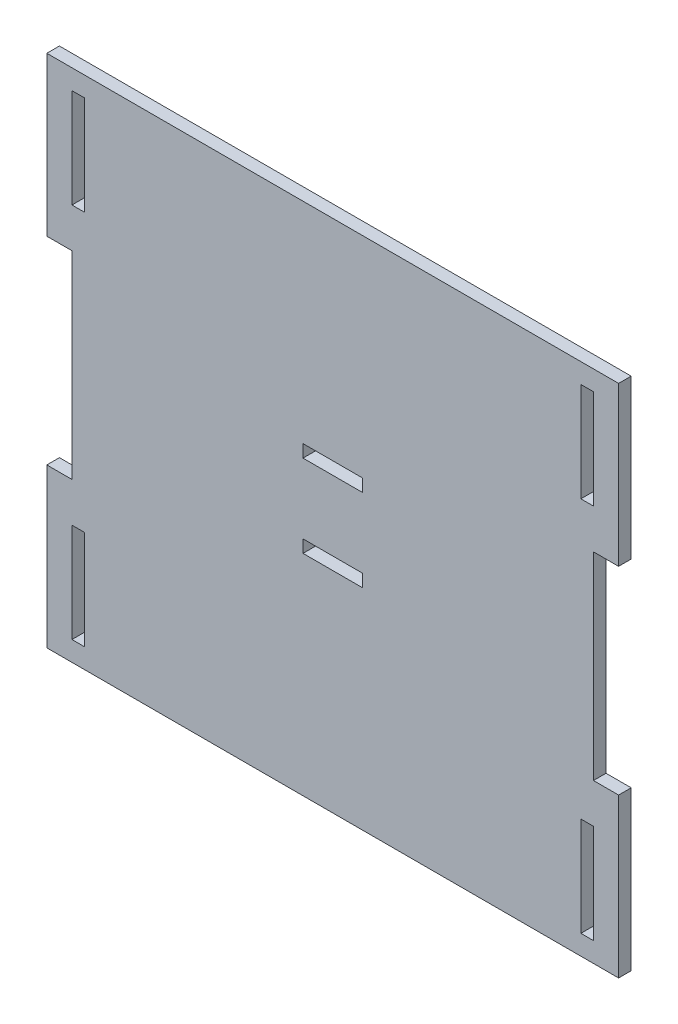
ISO-10303-21;
HEADER;
FILE_DESCRIPTION(('STEP AP214'),'2;1');
FILE_NAME('part.step','',(''),(''),'','','');
FILE_SCHEMA(('AUTOMOTIVE_DESIGN { 1 0 10303 214 1 1 1 1 }'));
ENDSEC;
DATA;
#1=APPLICATION_CONTEXT('core data for automotive mechanical design processes');
#2=APPLICATION_PROTOCOL_DEFINITION('international standard','automotive_design',2000,#1);
#3=PRODUCT_CONTEXT('',#1,'mechanical');
#4=PRODUCT('Part','Part','',(#3));
#5=PRODUCT_RELATED_PRODUCT_CATEGORY('part','',(#4));
#6=PRODUCT_DEFINITION_FORMATION('','',#4);
#7=PRODUCT_DEFINITION_CONTEXT('part definition',#1,'design');
#8=PRODUCT_DEFINITION('design','',#6,#7);
#9=PRODUCT_DEFINITION_SHAPE('','',#8);
#10=(LENGTH_UNIT() NAMED_UNIT(*) SI_UNIT(.MILLI.,.METRE.));
#11=(NAMED_UNIT(*) PLANE_ANGLE_UNIT() SI_UNIT($,.RADIAN.));
#12=(NAMED_UNIT(*) SI_UNIT($,.STERADIAN.) SOLID_ANGLE_UNIT());
#13=UNCERTAINTY_MEASURE_WITH_UNIT(LENGTH_MEASURE(1.E-05),#10,'distance_accuracy_value','');
#14=(GEOMETRIC_REPRESENTATION_CONTEXT(3) GLOBAL_UNCERTAINTY_ASSIGNED_CONTEXT((#13)) GLOBAL_UNIT_ASSIGNED_CONTEXT((#10,
#11,#12)) REPRESENTATION_CONTEXT('',''));
#15=CARTESIAN_POINT('',(0.,0.,0.));
#16=DIRECTION('',(0.,0.,1.));
#17=DIRECTION('',(1.,0.,0.));
#18=AXIS2_PLACEMENT_3D('',#15,#16,#17);
#19=CARTESIAN_POINT('',(0.,0.,3.175));
#20=DIRECTION('',(0.,0.,1.));
#21=DIRECTION('',(1.,0.,0.));
#22=AXIS2_PLACEMENT_3D('',#19,#20,#21);
#23=PLANE('',#22);
#24=DIRECTION('',(0.,-1.,0.));
#25=VECTOR('',#24,1.);
#26=CARTESIAN_POINT('',(0.,0.,3.175));
#27=LINE('',#26,#25);
#28=CARTESIAN_POINT('',(0.,40.,3.175));
#29=VERTEX_POINT('',#28);
#30=CARTESIAN_POINT('',(0.,0.,3.175));
#31=VERTEX_POINT('',#30);
#32=EDGE_CURVE('E457',#29,#31,#27,.T.);
#33=ORIENTED_EDGE('',*,*,#32,.T.);
#34=DIRECTION('',(1.,0.,0.));
#35=VECTOR('',#34,1.);
#36=CARTESIAN_POINT('',(0.,0.,3.175));
#37=LINE('',#36,#35);
#38=CARTESIAN_POINT('',(144.35,0.,3.175));
#39=VERTEX_POINT('',#38);
#40=EDGE_CURVE('E460',#31,#39,#37,.T.);
#41=ORIENTED_EDGE('',*,*,#40,.T.);
#42=DIRECTION('',(0.,1.,0.));
#43=VECTOR('',#42,1.);
#44=CARTESIAN_POINT('',(144.35,0.,3.175));
#45=LINE('',#44,#43);
#46=CARTESIAN_POINT('',(144.35,40.,3.175));
#47=VERTEX_POINT('',#46);
#48=EDGE_CURVE('E463',#39,#47,#45,.T.);
#49=ORIENTED_EDGE('',*,*,#48,.T.);
#50=DIRECTION('',(-1.,0.,0.));
#51=VECTOR('',#50,1.);
#52=CARTESIAN_POINT('',(138.,40.,3.175));
#53=LINE('',#52,#51);
#54=CARTESIAN_POINT('',(138.,40.,3.175));
#55=VERTEX_POINT('',#54);
#56=EDGE_CURVE('E465',#47,#55,#53,.T.);
#57=ORIENTED_EDGE('',*,*,#56,.T.);
#58=DIRECTION('',(0.,1.,0.));
#59=VECTOR('',#58,1.);
#60=CARTESIAN_POINT('',(138.,90.,3.175));
#61=LINE('',#60,#59);
#62=CARTESIAN_POINT('',(138.,90.,3.175));
#63=VERTEX_POINT('',#62);
#64=EDGE_CURVE('E467',#55,#63,#61,.T.);
#65=ORIENTED_EDGE('',*,*,#64,.T.);
#66=DIRECTION('',(1.,0.,0.));
#67=VECTOR('',#66,1.);
#68=CARTESIAN_POINT('',(144.35,90.,3.175));
#69=LINE('',#68,#67);
#70=CARTESIAN_POINT('',(144.35,90.,3.175));
#71=VERTEX_POINT('',#70);
#72=EDGE_CURVE('E469',#63,#71,#69,.T.);
#73=ORIENTED_EDGE('',*,*,#72,.T.);
#74=DIRECTION('',(0.,1.,0.));
#75=VECTOR('',#74,1.);
#76=CARTESIAN_POINT('',(144.35,90.,3.175));
#77=LINE('',#76,#75);
#78=CARTESIAN_POINT('',(144.35,130.,3.175));
#79=VERTEX_POINT('',#78);
#80=EDGE_CURVE('E471',#71,#79,#77,.T.);
#81=ORIENTED_EDGE('',*,*,#80,.T.);
#82=DIRECTION('',(-1.,0.,0.));
#83=VECTOR('',#82,1.);
#84=CARTESIAN_POINT('',(0.,130.,3.175));
#85=LINE('',#84,#83);
#86=CARTESIAN_POINT('',(0.,130.,3.175));
#87=VERTEX_POINT('',#86);
#88=EDGE_CURVE('E473',#79,#87,#85,.T.);
#89=ORIENTED_EDGE('',*,*,#88,.T.);
#90=DIRECTION('',(0.,-1.,0.));
#91=VECTOR('',#90,1.);
#92=CARTESIAN_POINT('',(0.,90.,3.175));
#93=LINE('',#92,#91);
#94=CARTESIAN_POINT('',(0.,90.,3.175));
#95=VERTEX_POINT('',#94);
#96=EDGE_CURVE('E475',#87,#95,#93,.T.);
#97=ORIENTED_EDGE('',*,*,#96,.T.);
#98=DIRECTION('',(1.,0.,0.));
#99=VECTOR('',#98,1.);
#100=CARTESIAN_POINT('',(0.,90.,3.175));
#101=LINE('',#100,#99);
#102=CARTESIAN_POINT('',(6.34999999999999,90.,3.175));
#103=VERTEX_POINT('',#102);
#104=EDGE_CURVE('E477',#95,#103,#101,.T.);
#105=ORIENTED_EDGE('',*,*,#104,.T.);
#106=DIRECTION('',(0.,-1.,0.));
#107=VECTOR('',#106,1.);
#108=CARTESIAN_POINT('',(6.34999999999999,90.,3.175));
#109=LINE('',#108,#107);
#110=CARTESIAN_POINT('',(6.35,40.,3.175));
#111=VERTEX_POINT('',#110);
#112=EDGE_CURVE('E479',#103,#111,#109,.T.);
#113=ORIENTED_EDGE('',*,*,#112,.T.);
#114=DIRECTION('',(-1.,0.,0.));
#115=VECTOR('',#114,1.);
#116=CARTESIAN_POINT('',(6.35,40.,3.175));
#117=LINE('',#116,#115);
#118=EDGE_CURVE('E481',#111,#29,#117,.T.);
#119=ORIENTED_EDGE('',*,*,#118,.T.);
#120=EDGE_LOOP('',(#33,#41,#49,#57,#65,#73,#81,#89,#97,#105,#113,#119));
#121=FACE_BOUND('',#120,.T.);
#122=DIRECTION('',(1.,0.,0.));
#123=VECTOR('',#122,1.);
#124=CARTESIAN_POINT('',(6.35,100.,3.175));
#125=LINE('',#124,#123);
#126=CARTESIAN_POINT('',(6.35,100.,3.175));
#127=VERTEX_POINT('',#126);
#128=CARTESIAN_POINT('',(9.525,100.,3.175));
#129=VERTEX_POINT('',#128);
#130=EDGE_CURVE('E428',#127,#129,#125,.T.);
#131=ORIENTED_EDGE('',*,*,#130,.F.);
#132=DIRECTION('',(0.,-1.,0.));
#133=VECTOR('',#132,1.);
#134=CARTESIAN_POINT('',(6.35,100.,3.175));
#135=LINE('',#134,#133);
#136=CARTESIAN_POINT('',(6.35,125.,3.175));
#137=VERTEX_POINT('',#136);
#138=EDGE_CURVE('E426',#137,#127,#135,.T.);
#139=ORIENTED_EDGE('',*,*,#138,.F.);
#140=DIRECTION('',(-1.,0.,0.));
#141=VECTOR('',#140,1.);
#142=CARTESIAN_POINT('',(6.35,125.,3.175));
#143=LINE('',#142,#141);
#144=CARTESIAN_POINT('',(9.525,125.,3.175));
#145=VERTEX_POINT('',#144);
#146=EDGE_CURVE('E434',#145,#137,#143,.T.);
#147=ORIENTED_EDGE('',*,*,#146,.F.);
#148=DIRECTION('',(0.,1.,0.));
#149=VECTOR('',#148,1.);
#150=CARTESIAN_POINT('',(9.525,100.,3.175));
#151=LINE('',#150,#149);
#152=EDGE_CURVE('E431',#129,#145,#151,.T.);
#153=ORIENTED_EDGE('',*,*,#152,.F.);
#154=EDGE_LOOP('',(#131,#139,#147,#153));
#155=FACE_BOUND('',#154,.T.);
#156=DIRECTION('',(-1.,0.,0.));
#157=VECTOR('',#156,1.);
#158=CARTESIAN_POINT('',(138.,125.,3.175));
#159=LINE('',#158,#157);
#160=CARTESIAN_POINT('',(138.,125.,3.175));
#161=VERTEX_POINT('',#160);
#162=CARTESIAN_POINT('',(134.825,125.,3.175));
#163=VERTEX_POINT('',#162);
#164=EDGE_CURVE('E397',#161,#163,#159,.T.);
#165=ORIENTED_EDGE('',*,*,#164,.F.);
#166=DIRECTION('',(0.,1.,0.));
#167=VECTOR('',#166,1.);
#168=CARTESIAN_POINT('',(138.,100.,3.175));
#169=LINE('',#168,#167);
#170=CARTESIAN_POINT('',(138.,100.,3.175));
#171=VERTEX_POINT('',#170);
#172=EDGE_CURVE('E395',#171,#161,#169,.T.);
#173=ORIENTED_EDGE('',*,*,#172,.F.);
#174=DIRECTION('',(1.,0.,0.));
#175=VECTOR('',#174,1.);
#176=CARTESIAN_POINT('',(138.,100.,3.175));
#177=LINE('',#176,#175);
#178=CARTESIAN_POINT('',(134.825,100.,3.175));
#179=VERTEX_POINT('',#178);
#180=EDGE_CURVE('E403',#179,#171,#177,.T.);
#181=ORIENTED_EDGE('',*,*,#180,.F.);
#182=DIRECTION('',(0.,-1.,0.));
#183=VECTOR('',#182,1.);
#184=CARTESIAN_POINT('',(134.825,100.,3.175));
#185=LINE('',#184,#183);
#186=EDGE_CURVE('E400',#163,#179,#185,.T.);
#187=ORIENTED_EDGE('',*,*,#186,.F.);
#188=EDGE_LOOP('',(#165,#173,#181,#187));
#189=FACE_BOUND('',#188,.T.);
#190=DIRECTION('',(1.,0.,0.));
#191=VECTOR('',#190,1.);
#192=CARTESIAN_POINT('',(6.35,5.,3.175));
#193=LINE('',#192,#191);
#194=CARTESIAN_POINT('',(6.35,5.,3.175));
#195=VERTEX_POINT('',#194);
#196=CARTESIAN_POINT('',(9.525,5.,3.175));
#197=VERTEX_POINT('',#196);
#198=EDGE_CURVE('E366',#195,#197,#193,.T.);
#199=ORIENTED_EDGE('',*,*,#198,.F.);
#200=DIRECTION('',(0.,-1.,0.));
#201=VECTOR('',#200,1.);
#202=CARTESIAN_POINT('',(6.35,30.,3.175));
#203=LINE('',#202,#201);
#204=CARTESIAN_POINT('',(6.35,30.,3.175));
#205=VERTEX_POINT('',#204);
#206=EDGE_CURVE('E364',#205,#195,#203,.T.);
#207=ORIENTED_EDGE('',*,*,#206,.F.);
#208=DIRECTION('',(-1.,0.,0.));
#209=VECTOR('',#208,1.);
#210=CARTESIAN_POINT('',(6.35,30.,3.175));
#211=LINE('',#210,#209);
#212=CARTESIAN_POINT('',(9.52499999999999,30.,3.175));
#213=VERTEX_POINT('',#212);
#214=EDGE_CURVE('E372',#213,#205,#211,.T.);
#215=ORIENTED_EDGE('',*,*,#214,.F.);
#216=DIRECTION('',(0.,1.,0.));
#217=VECTOR('',#216,1.);
#218=CARTESIAN_POINT('',(9.52499999999999,30.,3.175));
#219=LINE('',#218,#217);
#220=EDGE_CURVE('E369',#197,#213,#219,.T.);
#221=ORIENTED_EDGE('',*,*,#220,.F.);
#222=EDGE_LOOP('',(#199,#207,#215,#221));
#223=FACE_BOUND('',#222,.T.);
#224=DIRECTION('',(-1.,0.,0.));
#225=VECTOR('',#224,1.);
#226=CARTESIAN_POINT('',(138.,30.,3.175));
#227=LINE('',#226,#225);
#228=CARTESIAN_POINT('',(138.,30.,3.175));
#229=VERTEX_POINT('',#228);
#230=CARTESIAN_POINT('',(134.825,30.,3.175));
#231=VERTEX_POINT('',#230);
#232=EDGE_CURVE('E335',#229,#231,#227,.T.);
#233=ORIENTED_EDGE('',*,*,#232,.F.);
#234=DIRECTION('',(0.,1.,0.));
#235=VECTOR('',#234,1.);
#236=CARTESIAN_POINT('',(138.,30.,3.175));
#237=LINE('',#236,#235);
#238=CARTESIAN_POINT('',(138.,5.,3.175));
#239=VERTEX_POINT('',#238);
#240=EDGE_CURVE('E333',#239,#229,#237,.T.);
#241=ORIENTED_EDGE('',*,*,#240,.F.);
#242=DIRECTION('',(1.,0.,0.));
#243=VECTOR('',#242,1.);
#244=CARTESIAN_POINT('',(138.,5.,3.175));
#245=LINE('',#244,#243);
#246=CARTESIAN_POINT('',(134.825,5.00000000000002,3.175));
#247=VERTEX_POINT('',#246);
#248=EDGE_CURVE('E341',#247,#239,#245,.T.);
#249=ORIENTED_EDGE('',*,*,#248,.F.);
#250=DIRECTION('',(0.,-1.,0.));
#251=VECTOR('',#250,1.);
#252=CARTESIAN_POINT('',(134.825,30.,3.175));
#253=LINE('',#252,#251);
#254=EDGE_CURVE('E338',#231,#247,#253,.T.);
#255=ORIENTED_EDGE('',*,*,#254,.F.);
#256=EDGE_LOOP('',(#233,#241,#249,#255));
#257=FACE_BOUND('',#256,.T.);
#258=DIRECTION('',(1.,0.,0.));
#259=VECTOR('',#258,1.);
#260=CARTESIAN_POINT('',(64.675,53.,3.175));
#261=LINE('',#260,#259);
#262=CARTESIAN_POINT('',(64.675,53.,3.175));
#263=VERTEX_POINT('',#262);
#264=CARTESIAN_POINT('',(79.675,53.,3.175));
#265=VERTEX_POINT('',#264);
#266=EDGE_CURVE('E304',#263,#265,#261,.T.);
#267=ORIENTED_EDGE('',*,*,#266,.F.);
#268=DIRECTION('',(0.,-1.,0.));
#269=VECTOR('',#268,1.);
#270=CARTESIAN_POINT('',(64.675,56.175,3.175));
#271=LINE('',#270,#269);
#272=CARTESIAN_POINT('',(64.675,56.175,3.175));
#273=VERTEX_POINT('',#272);
#274=EDGE_CURVE('E302',#273,#263,#271,.T.);
#275=ORIENTED_EDGE('',*,*,#274,.F.);
#276=DIRECTION('',(-1.,0.,0.));
#277=VECTOR('',#276,1.);
#278=CARTESIAN_POINT('',(64.675,56.175,3.175));
#279=LINE('',#278,#277);
#280=CARTESIAN_POINT('',(79.675,56.175,3.175));
#281=VERTEX_POINT('',#280);
#282=EDGE_CURVE('E310',#281,#273,#279,.T.);
#283=ORIENTED_EDGE('',*,*,#282,.F.);
#284=DIRECTION('',(0.,1.,0.));
#285=VECTOR('',#284,1.);
#286=CARTESIAN_POINT('',(79.675,56.175,3.175));
#287=LINE('',#286,#285);
#288=EDGE_CURVE('E307',#265,#281,#287,.T.);
#289=ORIENTED_EDGE('',*,*,#288,.F.);
#290=EDGE_LOOP('',(#267,#275,#283,#289));
#291=FACE_BOUND('',#290,.T.);
#292=DIRECTION('',(1.,0.,0.));
#293=VECTOR('',#292,1.);
#294=CARTESIAN_POINT('',(64.675,73.825,3.175));
#295=LINE('',#294,#293);
#296=CARTESIAN_POINT('',(64.675,73.825,3.175));
#297=VERTEX_POINT('',#296);
#298=CARTESIAN_POINT('',(79.675,73.825,3.175));
#299=VERTEX_POINT('',#298);
#300=EDGE_CURVE('E274',#297,#299,#295,.T.);
#301=ORIENTED_EDGE('',*,*,#300,.F.);
#302=DIRECTION('',(0.,-1.,0.));
#303=VECTOR('',#302,1.);
#304=CARTESIAN_POINT('',(64.675,73.825,3.175));
#305=LINE('',#304,#303);
#306=CARTESIAN_POINT('',(64.675,77.,3.175));
#307=VERTEX_POINT('',#306);
#308=EDGE_CURVE('E266',#307,#297,#305,.T.);
#309=ORIENTED_EDGE('',*,*,#308,.F.);
#310=DIRECTION('',(-1.,0.,0.));
#311=VECTOR('',#310,1.);
#312=CARTESIAN_POINT('',(64.675,77.,3.175));
#313=LINE('',#312,#311);
#314=CARTESIAN_POINT('',(79.675,77.,3.175));
#315=VERTEX_POINT('',#314);
#316=EDGE_CURVE('E288',#315,#307,#313,.T.);
#317=ORIENTED_EDGE('',*,*,#316,.F.);
#318=DIRECTION('',(0.,1.,0.));
#319=VECTOR('',#318,1.);
#320=CARTESIAN_POINT('',(79.675,73.825,3.175));
#321=LINE('',#320,#319);
#322=EDGE_CURVE('E286',#299,#315,#321,.T.);
#323=ORIENTED_EDGE('',*,*,#322,.F.);
#324=EDGE_LOOP('',(#301,#309,#317,#323));
#325=FACE_BOUND('',#324,.T.);
#326=ADVANCED_FACE('F33',(#121,#155,#189,#223,#257,#291,#325),#23,.T.);
#327=CARTESIAN_POINT('',(0.,0.,0.));
#328=DIRECTION('',(0.,0.,1.));
#329=DIRECTION('',(1.,0.,0.));
#330=AXIS2_PLACEMENT_3D('',#327,#328,#329);
#331=PLANE('',#330);
#332=DIRECTION('',(0.,-1.,0.));
#333=VECTOR('',#332,1.);
#334=CARTESIAN_POINT('',(64.675,56.175,0.));
#335=LINE('',#334,#333);
#336=CARTESIAN_POINT('',(64.675,56.175,0.));
#337=VERTEX_POINT('',#336);
#338=CARTESIAN_POINT('',(64.675,53.,0.));
#339=VERTEX_POINT('',#338);
#340=EDGE_CURVE('E282',#337,#339,#335,.T.);
#341=ORIENTED_EDGE('',*,*,#340,.T.);
#342=DIRECTION('',(1.,0.,0.));
#343=VECTOR('',#342,1.);
#344=CARTESIAN_POINT('',(64.675,53.,0.));
#345=LINE('',#344,#343);
#346=CARTESIAN_POINT('',(79.675,53.,0.));
#347=VERTEX_POINT('',#346);
#348=EDGE_CURVE('E315',#339,#347,#345,.T.);
#349=ORIENTED_EDGE('',*,*,#348,.T.);
#350=DIRECTION('',(0.,1.,0.));
#351=VECTOR('',#350,1.);
#352=CARTESIAN_POINT('',(79.675,56.175,0.));
#353=LINE('',#352,#351);
#354=CARTESIAN_POINT('',(79.675,56.175,0.));
#355=VERTEX_POINT('',#354);
#356=EDGE_CURVE('E318',#347,#355,#353,.T.);
#357=ORIENTED_EDGE('',*,*,#356,.T.);
#358=DIRECTION('',(-1.,0.,0.));
#359=VECTOR('',#358,1.);
#360=CARTESIAN_POINT('',(64.675,56.175,0.));
#361=LINE('',#360,#359);
#362=EDGE_CURVE('E305',#355,#337,#361,.T.);
#363=ORIENTED_EDGE('',*,*,#362,.T.);
#364=EDGE_LOOP('',(#341,#349,#357,#363));
#365=FACE_BOUND('',#364,.T.);
#366=DIRECTION('',(0.,-1.,0.));
#367=VECTOR('',#366,1.);
#368=CARTESIAN_POINT('',(6.35,30.,0.));
#369=LINE('',#368,#367);
#370=CARTESIAN_POINT('',(6.35,30.,0.));
#371=VERTEX_POINT('',#370);
#372=CARTESIAN_POINT('',(6.35,5.,0.));
#373=VERTEX_POINT('',#372);
#374=EDGE_CURVE('E363',#371,#373,#369,.T.);
#375=ORIENTED_EDGE('',*,*,#374,.T.);
#376=DIRECTION('',(1.,0.,0.));
#377=VECTOR('',#376,1.);
#378=CARTESIAN_POINT('',(6.35,5.,0.));
#379=LINE('',#378,#377);
#380=CARTESIAN_POINT('',(9.525,5.,0.));
#381=VERTEX_POINT('',#380);
#382=EDGE_CURVE('E377',#373,#381,#379,.T.);
#383=ORIENTED_EDGE('',*,*,#382,.T.);
#384=DIRECTION('',(0.,1.,0.));
#385=VECTOR('',#384,1.);
#386=CARTESIAN_POINT('',(9.52499999999999,30.,0.));
#387=LINE('',#386,#385);
#388=CARTESIAN_POINT('',(9.52499999999999,30.,0.));
#389=VERTEX_POINT('',#388);
#390=EDGE_CURVE('E380',#381,#389,#387,.T.);
#391=ORIENTED_EDGE('',*,*,#390,.T.);
#392=DIRECTION('',(-1.,0.,0.));
#393=VECTOR('',#392,1.);
#394=CARTESIAN_POINT('',(6.35,30.,0.));
#395=LINE('',#394,#393);
#396=EDGE_CURVE('E367',#389,#371,#395,.T.);
#397=ORIENTED_EDGE('',*,*,#396,.T.);
#398=EDGE_LOOP('',(#375,#383,#391,#397));
#399=FACE_BOUND('',#398,.T.);
#400=DIRECTION('',(0.,-1.,0.));
#401=VECTOR('',#400,1.);
#402=CARTESIAN_POINT('',(6.35,100.,0.));
#403=LINE('',#402,#401);
#404=CARTESIAN_POINT('',(6.35,125.,0.));
#405=VERTEX_POINT('',#404);
#406=CARTESIAN_POINT('',(6.35,100.,0.));
#407=VERTEX_POINT('',#406);
#408=EDGE_CURVE('E425',#405,#407,#403,.T.);
#409=ORIENTED_EDGE('',*,*,#408,.T.);
#410=DIRECTION('',(1.,0.,0.));
#411=VECTOR('',#410,1.);
#412=CARTESIAN_POINT('',(6.35,100.,0.));
#413=LINE('',#412,#411);
#414=CARTESIAN_POINT('',(9.525,100.,0.));
#415=VERTEX_POINT('',#414);
#416=EDGE_CURVE('E439',#407,#415,#413,.T.);
#417=ORIENTED_EDGE('',*,*,#416,.T.);
#418=DIRECTION('',(0.,1.,0.));
#419=VECTOR('',#418,1.);
#420=CARTESIAN_POINT('',(9.525,100.,0.));
#421=LINE('',#420,#419);
#422=CARTESIAN_POINT('',(9.525,125.,0.));
#423=VERTEX_POINT('',#422);
#424=EDGE_CURVE('E442',#415,#423,#421,.T.);
#425=ORIENTED_EDGE('',*,*,#424,.T.);
#426=DIRECTION('',(-1.,0.,0.));
#427=VECTOR('',#426,1.);
#428=CARTESIAN_POINT('',(6.35,125.,0.));
#429=LINE('',#428,#427);
#430=EDGE_CURVE('E429',#423,#405,#429,.T.);
#431=ORIENTED_EDGE('',*,*,#430,.T.);
#432=EDGE_LOOP('',(#409,#417,#425,#431));
#433=FACE_BOUND('',#432,.T.);
#434=DIRECTION('',(0.,-1.,0.));
#435=VECTOR('',#434,1.);
#436=CARTESIAN_POINT('',(0.,0.,0.));
#437=LINE('',#436,#435);
#438=CARTESIAN_POINT('',(0.,40.,0.));
#439=VERTEX_POINT('',#438);
#440=CARTESIAN_POINT('',(0.,0.,0.));
#441=VERTEX_POINT('',#440);
#442=EDGE_CURVE('E456',#439,#441,#437,.T.);
#443=ORIENTED_EDGE('',*,*,#442,.F.);
#444=DIRECTION('',(-1.,0.,0.));
#445=VECTOR('',#444,1.);
#446=CARTESIAN_POINT('',(6.35,40.,0.));
#447=LINE('',#446,#445);
#448=CARTESIAN_POINT('',(6.35,40.,0.));
#449=VERTEX_POINT('',#448);
#450=EDGE_CURVE('E461',#449,#439,#447,.T.);
#451=ORIENTED_EDGE('',*,*,#450,.F.);
#452=DIRECTION('',(0.,-1.,0.));
#453=VECTOR('',#452,1.);
#454=CARTESIAN_POINT('',(6.34999999999999,90.,0.));
#455=LINE('',#454,#453);
#456=CARTESIAN_POINT('',(6.34999999999999,90.,0.));
#457=VERTEX_POINT('',#456);
#458=EDGE_CURVE('E504',#457,#449,#455,.T.);
#459=ORIENTED_EDGE('',*,*,#458,.F.);
#460=DIRECTION('',(1.,0.,0.));
#461=VECTOR('',#460,1.);
#462=CARTESIAN_POINT('',(0.,90.,0.));
#463=LINE('',#462,#461);
#464=CARTESIAN_POINT('',(0.,90.,0.));
#465=VERTEX_POINT('',#464);
#466=EDGE_CURVE('E502',#465,#457,#463,.T.);
#467=ORIENTED_EDGE('',*,*,#466,.F.);
#468=DIRECTION('',(0.,-1.,0.));
#469=VECTOR('',#468,1.);
#470=CARTESIAN_POINT('',(0.,90.,0.));
#471=LINE('',#470,#469);
#472=CARTESIAN_POINT('',(0.,130.,0.));
#473=VERTEX_POINT('',#472);
#474=EDGE_CURVE('E500',#473,#465,#471,.T.);
#475=ORIENTED_EDGE('',*,*,#474,.F.);
#476=DIRECTION('',(-1.,0.,0.));
#477=VECTOR('',#476,1.);
#478=CARTESIAN_POINT('',(0.,130.,0.));
#479=LINE('',#478,#477);
#480=CARTESIAN_POINT('',(144.35,130.,0.));
#481=VERTEX_POINT('',#480);
#482=EDGE_CURVE('E498',#481,#473,#479,.T.);
#483=ORIENTED_EDGE('',*,*,#482,.F.);
#484=DIRECTION('',(0.,1.,0.));
#485=VECTOR('',#484,1.);
#486=CARTESIAN_POINT('',(144.35,90.,0.));
#487=LINE('',#486,#485);
#488=CARTESIAN_POINT('',(144.35,90.,0.));
#489=VERTEX_POINT('',#488);
#490=EDGE_CURVE('E496',#489,#481,#487,.T.);
#491=ORIENTED_EDGE('',*,*,#490,.F.);
#492=DIRECTION('',(1.,0.,0.));
#493=VECTOR('',#492,1.);
#494=CARTESIAN_POINT('',(144.35,90.,0.));
#495=LINE('',#494,#493);
#496=CARTESIAN_POINT('',(138.,90.,0.));
#497=VERTEX_POINT('',#496);
#498=EDGE_CURVE('E494',#497,#489,#495,.T.);
#499=ORIENTED_EDGE('',*,*,#498,.F.);
#500=DIRECTION('',(0.,1.,0.));
#501=VECTOR('',#500,1.);
#502=CARTESIAN_POINT('',(138.,90.,0.));
#503=LINE('',#502,#501);
#504=CARTESIAN_POINT('',(138.,40.,0.));
#505=VERTEX_POINT('',#504);
#506=EDGE_CURVE('E492',#505,#497,#503,.T.);
#507=ORIENTED_EDGE('',*,*,#506,.F.);
#508=DIRECTION('',(-1.,0.,0.));
#509=VECTOR('',#508,1.);
#510=CARTESIAN_POINT('',(138.,40.,0.));
#511=LINE('',#510,#509);
#512=CARTESIAN_POINT('',(144.35,40.,0.));
#513=VERTEX_POINT('',#512);
#514=EDGE_CURVE('E490',#513,#505,#511,.T.);
#515=ORIENTED_EDGE('',*,*,#514,.F.);
#516=DIRECTION('',(0.,1.,0.));
#517=VECTOR('',#516,1.);
#518=CARTESIAN_POINT('',(144.35,0.,0.));
#519=LINE('',#518,#517);
#520=CARTESIAN_POINT('',(144.35,0.,0.));
#521=VERTEX_POINT('',#520);
#522=EDGE_CURVE('E488',#521,#513,#519,.T.);
#523=ORIENTED_EDGE('',*,*,#522,.F.);
#524=DIRECTION('',(1.,0.,0.));
#525=VECTOR('',#524,1.);
#526=CARTESIAN_POINT('',(0.,0.,0.));
#527=LINE('',#526,#525);
#528=EDGE_CURVE('E486',#441,#521,#527,.T.);
#529=ORIENTED_EDGE('',*,*,#528,.F.);
#530=EDGE_LOOP('',(#443,#451,#459,#467,#475,#483,#491,#499,#507,#515,#523,#529));
#531=FACE_BOUND('',#530,.T.);
#532=DIRECTION('',(0.,1.,0.));
#533=VECTOR('',#532,1.);
#534=CARTESIAN_POINT('',(138.,100.,0.));
#535=LINE('',#534,#533);
#536=CARTESIAN_POINT('',(138.,100.,0.));
#537=VERTEX_POINT('',#536);
#538=CARTESIAN_POINT('',(138.,125.,0.));
#539=VERTEX_POINT('',#538);
#540=EDGE_CURVE('E394',#537,#539,#535,.T.);
#541=ORIENTED_EDGE('',*,*,#540,.T.);
#542=DIRECTION('',(-1.,0.,0.));
#543=VECTOR('',#542,1.);
#544=CARTESIAN_POINT('',(138.,125.,0.));
#545=LINE('',#544,#543);
#546=CARTESIAN_POINT('',(134.825,125.,0.));
#547=VERTEX_POINT('',#546);
#548=EDGE_CURVE('E408',#539,#547,#545,.T.);
#549=ORIENTED_EDGE('',*,*,#548,.T.);
#550=DIRECTION('',(0.,-1.,0.));
#551=VECTOR('',#550,1.);
#552=CARTESIAN_POINT('',(134.825,100.,0.));
#553=LINE('',#552,#551);
#554=CARTESIAN_POINT('',(134.825,100.,0.));
#555=VERTEX_POINT('',#554);
#556=EDGE_CURVE('E411',#547,#555,#553,.T.);
#557=ORIENTED_EDGE('',*,*,#556,.T.);
#558=DIRECTION('',(1.,0.,0.));
#559=VECTOR('',#558,1.);
#560=CARTESIAN_POINT('',(138.,100.,0.));
#561=LINE('',#560,#559);
#562=EDGE_CURVE('E398',#555,#537,#561,.T.);
#563=ORIENTED_EDGE('',*,*,#562,.T.);
#564=EDGE_LOOP('',(#541,#549,#557,#563));
#565=FACE_BOUND('',#564,.T.);
#566=DIRECTION('',(0.,1.,0.));
#567=VECTOR('',#566,1.);
#568=CARTESIAN_POINT('',(138.,30.,0.));
#569=LINE('',#568,#567);
#570=CARTESIAN_POINT('',(138.,5.,0.));
#571=VERTEX_POINT('',#570);
#572=CARTESIAN_POINT('',(138.,30.,0.));
#573=VERTEX_POINT('',#572);
#574=EDGE_CURVE('E332',#571,#573,#569,.T.);
#575=ORIENTED_EDGE('',*,*,#574,.T.);
#576=DIRECTION('',(-1.,0.,0.));
#577=VECTOR('',#576,1.);
#578=CARTESIAN_POINT('',(138.,30.,0.));
#579=LINE('',#578,#577);
#580=CARTESIAN_POINT('',(134.825,30.,0.));
#581=VERTEX_POINT('',#580);
#582=EDGE_CURVE('E346',#573,#581,#579,.T.);
#583=ORIENTED_EDGE('',*,*,#582,.T.);
#584=DIRECTION('',(0.,-1.,0.));
#585=VECTOR('',#584,1.);
#586=CARTESIAN_POINT('',(134.825,30.,0.));
#587=LINE('',#586,#585);
#588=CARTESIAN_POINT('',(134.825,5.00000000000002,0.));
#589=VERTEX_POINT('',#588);
#590=EDGE_CURVE('E349',#581,#589,#587,.T.);
#591=ORIENTED_EDGE('',*,*,#590,.T.);
#592=DIRECTION('',(1.,0.,0.));
#593=VECTOR('',#592,1.);
#594=CARTESIAN_POINT('',(138.,5.,0.));
#595=LINE('',#594,#593);
#596=EDGE_CURVE('E336',#589,#571,#595,.T.);
#597=ORIENTED_EDGE('',*,*,#596,.T.);
#598=EDGE_LOOP('',(#575,#583,#591,#597));
#599=FACE_BOUND('',#598,.T.);
#600=DIRECTION('',(0.,-1.,0.));
#601=VECTOR('',#600,1.);
#602=CARTESIAN_POINT('',(64.675,73.825,0.));
#603=LINE('',#602,#601);
#604=CARTESIAN_POINT('',(64.675,77.,0.));
#605=VERTEX_POINT('',#604);
#606=CARTESIAN_POINT('',(64.675,73.825,0.));
#607=VERTEX_POINT('',#606);
#608=EDGE_CURVE('E56',#605,#607,#603,.T.);
#609=ORIENTED_EDGE('',*,*,#608,.T.);
#610=DIRECTION('',(1.,0.,0.));
#611=VECTOR('',#610,1.);
#612=CARTESIAN_POINT('',(64.675,73.825,0.));
#613=LINE('',#612,#611);
#614=CARTESIAN_POINT('',(79.675,73.825,0.));
#615=VERTEX_POINT('',#614);
#616=EDGE_CURVE('E281',#607,#615,#613,.T.);
#617=ORIENTED_EDGE('',*,*,#616,.T.);
#618=DIRECTION('',(0.,1.,0.));
#619=VECTOR('',#618,1.);
#620=CARTESIAN_POINT('',(79.675,73.825,0.));
#621=LINE('',#620,#619);
#622=CARTESIAN_POINT('',(79.675,77.,0.));
#623=VERTEX_POINT('',#622);
#624=EDGE_CURVE('E294',#615,#623,#621,.T.);
#625=ORIENTED_EDGE('',*,*,#624,.T.);
#626=DIRECTION('',(-1.,0.,0.));
#627=VECTOR('',#626,1.);
#628=CARTESIAN_POINT('',(64.675,77.,0.));
#629=LINE('',#628,#627);
#630=EDGE_CURVE('E275',#623,#605,#629,.T.);
#631=ORIENTED_EDGE('',*,*,#630,.T.);
#632=EDGE_LOOP('',(#609,#617,#625,#631));
#633=FACE_BOUND('',#632,.T.);
#634=ADVANCED_FACE('F546',(#365,#399,#433,#531,#565,#599,#633),#331,.F.);
#635=CARTESIAN_POINT('',(0.,0.,3.175));
#636=DIRECTION('',(1.,0.,0.));
#637=DIRECTION('',(0.,0.,-1.));
#638=AXIS2_PLACEMENT_3D('',#635,#636,#637);
#639=PLANE('',#638);
#640=ORIENTED_EDGE('',*,*,#442,.T.);
#641=DIRECTION('',(0.,0.,-1.));
#642=VECTOR('',#641,1.);
#643=CARTESIAN_POINT('',(0.,0.,3.175));
#644=LINE('',#643,#642);
#645=EDGE_CURVE('E11',#31,#441,#644,.T.);
#646=ORIENTED_EDGE('',*,*,#645,.F.);
#647=ORIENTED_EDGE('',*,*,#32,.F.);
#648=DIRECTION('',(0.,0.,-1.));
#649=VECTOR('',#648,1.);
#650=CARTESIAN_POINT('',(0.,40.,3.175));
#651=LINE('',#650,#649);
#652=EDGE_CURVE('E483',#29,#439,#651,.T.);
#653=ORIENTED_EDGE('',*,*,#652,.T.);
#654=EDGE_LOOP('',(#640,#646,#647,#653));
#655=FACE_BOUND('',#654,.T.);
#656=ADVANCED_FACE('F35',(#655),#639,.F.);
#657=CARTESIAN_POINT('',(0.,0.,3.175));
#658=DIRECTION('',(0.,1.,0.));
#659=DIRECTION('',(0.,0.,1.));
#660=AXIS2_PLACEMENT_3D('',#657,#658,#659);
#661=PLANE('',#660);
#662=ORIENTED_EDGE('',*,*,#528,.T.);
#663=DIRECTION('',(0.,0.,-1.));
#664=VECTOR('',#663,1.);
#665=CARTESIAN_POINT('',(144.35,0.,3.175));
#666=LINE('',#665,#664);
#667=EDGE_CURVE('E41',#39,#521,#666,.T.);
#668=ORIENTED_EDGE('',*,*,#667,.F.);
#669=ORIENTED_EDGE('',*,*,#40,.F.);
#670=ORIENTED_EDGE('',*,*,#645,.T.);
#671=EDGE_LOOP('',(#662,#668,#669,#670));
#672=FACE_BOUND('',#671,.T.);
#673=ADVANCED_FACE('F564',(#672),#661,.F.);
#674=CARTESIAN_POINT('',(144.35,0.,3.175));
#675=DIRECTION('',(-1.,0.,0.));
#676=DIRECTION('',(0.,0.,1.));
#677=AXIS2_PLACEMENT_3D('',#674,#675,#676);
#678=PLANE('',#677);
#679=ORIENTED_EDGE('',*,*,#522,.T.);
#680=DIRECTION('',(0.,0.,-1.));
#681=VECTOR('',#680,1.);
#682=CARTESIAN_POINT('',(144.35,40.,3.175));
#683=LINE('',#682,#681);
#684=EDGE_CURVE('E533',#47,#513,#683,.T.);
#685=ORIENTED_EDGE('',*,*,#684,.F.);
#686=ORIENTED_EDGE('',*,*,#48,.F.);
#687=ORIENTED_EDGE('',*,*,#667,.T.);
#688=EDGE_LOOP('',(#679,#685,#686,#687));
#689=FACE_BOUND('',#688,.T.);
#690=ADVANCED_FACE('F540',(#689),#678,.F.);
#691=CARTESIAN_POINT('',(138.,40.,3.175));
#692=DIRECTION('',(0.,-1.,0.));
#693=DIRECTION('',(1.,0.,0.));
#694=AXIS2_PLACEMENT_3D('',#691,#692,#693);
#695=PLANE('',#694);
#696=ORIENTED_EDGE('',*,*,#514,.T.);
#697=DIRECTION('',(0.,0.,-1.));
#698=VECTOR('',#697,1.);
#699=CARTESIAN_POINT('',(138.,40.,3.175));
#700=LINE('',#699,#698);
#701=EDGE_CURVE('E530',#55,#505,#700,.T.);
#702=ORIENTED_EDGE('',*,*,#701,.F.);
#703=ORIENTED_EDGE('',*,*,#56,.F.);
#704=ORIENTED_EDGE('',*,*,#684,.T.);
#705=EDGE_LOOP('',(#696,#702,#703,#704));
#706=FACE_BOUND('',#705,.T.);
#707=ADVANCED_FACE('F552',(#706),#695,.F.);
#708=CARTESIAN_POINT('',(138.,90.,3.175));
#709=DIRECTION('',(-1.,0.,0.));
#710=DIRECTION('',(0.,0.,1.));
#711=AXIS2_PLACEMENT_3D('',#708,#709,#710);
#712=PLANE('',#711);
#713=ORIENTED_EDGE('',*,*,#506,.T.);
#714=DIRECTION('',(0.,0.,-1.));
#715=VECTOR('',#714,1.);
#716=CARTESIAN_POINT('',(138.,90.,3.175));
#717=LINE('',#716,#715);
#718=EDGE_CURVE('E527',#63,#497,#717,.T.);
#719=ORIENTED_EDGE('',*,*,#718,.F.);
#720=ORIENTED_EDGE('',*,*,#64,.F.);
#721=ORIENTED_EDGE('',*,*,#701,.T.);
#722=EDGE_LOOP('',(#713,#719,#720,#721));
#723=FACE_BOUND('',#722,.T.);
#724=ADVANCED_FACE('F556',(#723),#712,.F.);
#725=CARTESIAN_POINT('',(144.35,90.,3.175));
#726=DIRECTION('',(0.,1.,0.));
#727=DIRECTION('',(-1.,0.,0.));
#728=AXIS2_PLACEMENT_3D('',#725,#726,#727);
#729=PLANE('',#728);
#730=ORIENTED_EDGE('',*,*,#498,.T.);
#731=DIRECTION('',(0.,0.,-1.));
#732=VECTOR('',#731,1.);
#733=CARTESIAN_POINT('',(144.35,90.,3.175));
#734=LINE('',#733,#732);
#735=EDGE_CURVE('E524',#71,#489,#734,.T.);
#736=ORIENTED_EDGE('',*,*,#735,.F.);
#737=ORIENTED_EDGE('',*,*,#72,.F.);
#738=ORIENTED_EDGE('',*,*,#718,.T.);
#739=EDGE_LOOP('',(#730,#736,#737,#738));
#740=FACE_BOUND('',#739,.T.);
#741=ADVANCED_FACE('F597',(#740),#729,.F.);
#742=CARTESIAN_POINT('',(144.35,90.,3.175));
#743=DIRECTION('',(-1.,0.,0.));
#744=DIRECTION('',(0.,0.,1.));
#745=AXIS2_PLACEMENT_3D('',#742,#743,#744);
#746=PLANE('',#745);
#747=ORIENTED_EDGE('',*,*,#490,.T.);
#748=DIRECTION('',(0.,0.,-1.));
#749=VECTOR('',#748,1.);
#750=CARTESIAN_POINT('',(144.35,130.,3.175));
#751=LINE('',#750,#749);
#752=EDGE_CURVE('E521',#79,#481,#751,.T.);
#753=ORIENTED_EDGE('',*,*,#752,.F.);
#754=ORIENTED_EDGE('',*,*,#80,.F.);
#755=ORIENTED_EDGE('',*,*,#735,.T.);
#756=EDGE_LOOP('',(#747,#753,#754,#755));
#757=FACE_BOUND('',#756,.T.);
#758=ADVANCED_FACE('F595',(#757),#746,.F.);
#759=CARTESIAN_POINT('',(0.,130.,3.175));
#760=DIRECTION('',(0.,-1.,0.));
#761=DIRECTION('',(0.,0.,-1.));
#762=AXIS2_PLACEMENT_3D('',#759,#760,#761);
#763=PLANE('',#762);
#764=ORIENTED_EDGE('',*,*,#482,.T.);
#765=DIRECTION('',(0.,0.,-1.));
#766=VECTOR('',#765,1.);
#767=CARTESIAN_POINT('',(0.,130.,3.175));
#768=LINE('',#767,#766);
#769=EDGE_CURVE('E518',#87,#473,#768,.T.);
#770=ORIENTED_EDGE('',*,*,#769,.F.);
#771=ORIENTED_EDGE('',*,*,#88,.F.);
#772=ORIENTED_EDGE('',*,*,#752,.T.);
#773=EDGE_LOOP('',(#764,#770,#771,#772));
#774=FACE_BOUND('',#773,.T.);
#775=ADVANCED_FACE('F591',(#774),#763,.F.);
#776=CARTESIAN_POINT('',(0.,90.,3.175));
#777=DIRECTION('',(1.,0.,0.));
#778=DIRECTION('',(0.,0.,-1.));
#779=AXIS2_PLACEMENT_3D('',#776,#777,#778);
#780=PLANE('',#779);
#781=ORIENTED_EDGE('',*,*,#474,.T.);
#782=DIRECTION('',(0.,0.,-1.));
#783=VECTOR('',#782,1.);
#784=CARTESIAN_POINT('',(0.,90.,3.175));
#785=LINE('',#784,#783);
#786=EDGE_CURVE('E515',#95,#465,#785,.T.);
#787=ORIENTED_EDGE('',*,*,#786,.F.);
#788=ORIENTED_EDGE('',*,*,#96,.F.);
#789=ORIENTED_EDGE('',*,*,#769,.T.);
#790=EDGE_LOOP('',(#781,#787,#788,#789));
#791=FACE_BOUND('',#790,.T.);
#792=ADVANCED_FACE('F586',(#791),#780,.F.);
#793=CARTESIAN_POINT('',(0.,90.,3.175));
#794=DIRECTION('',(0.,1.,0.));
#795=DIRECTION('',(-1.,0.,0.));
#796=AXIS2_PLACEMENT_3D('',#793,#794,#795);
#797=PLANE('',#796);
#798=ORIENTED_EDGE('',*,*,#466,.T.);
#799=DIRECTION('',(0.,0.,-1.));
#800=VECTOR('',#799,1.);
#801=CARTESIAN_POINT('',(6.34999999999999,90.,3.175));
#802=LINE('',#801,#800);
#803=EDGE_CURVE('E512',#103,#457,#802,.T.);
#804=ORIENTED_EDGE('',*,*,#803,.F.);
#805=ORIENTED_EDGE('',*,*,#104,.F.);
#806=ORIENTED_EDGE('',*,*,#786,.T.);
#807=EDGE_LOOP('',(#798,#804,#805,#806));
#808=FACE_BOUND('',#807,.T.);
#809=ADVANCED_FACE('F580',(#808),#797,.F.);
#810=CARTESIAN_POINT('',(6.34999999999999,90.,3.175));
#811=DIRECTION('',(1.,0.,0.));
#812=DIRECTION('',(0.,1.,0.));
#813=AXIS2_PLACEMENT_3D('',#810,#811,#812);
#814=PLANE('',#813);
#815=ORIENTED_EDGE('',*,*,#458,.T.);
#816=DIRECTION('',(0.,0.,-1.));
#817=VECTOR('',#816,1.);
#818=CARTESIAN_POINT('',(6.35,40.,3.175));
#819=LINE('',#818,#817);
#820=EDGE_CURVE('E509',#111,#449,#819,.T.);
#821=ORIENTED_EDGE('',*,*,#820,.F.);
#822=ORIENTED_EDGE('',*,*,#112,.F.);
#823=ORIENTED_EDGE('',*,*,#803,.T.);
#824=EDGE_LOOP('',(#815,#821,#822,#823));
#825=FACE_BOUND('',#824,.T.);
#826=ADVANCED_FACE('F576',(#825),#814,.F.);
#827=CARTESIAN_POINT('',(6.35,40.,3.175));
#828=DIRECTION('',(0.,-1.,0.));
#829=DIRECTION('',(1.,0.,0.));
#830=AXIS2_PLACEMENT_3D('',#827,#828,#829);
#831=PLANE('',#830);
#832=ORIENTED_EDGE('',*,*,#450,.T.);
#833=ORIENTED_EDGE('',*,*,#652,.F.);
#834=ORIENTED_EDGE('',*,*,#118,.F.);
#835=ORIENTED_EDGE('',*,*,#820,.T.);
#836=EDGE_LOOP('',(#832,#833,#834,#835));
#837=FACE_BOUND('',#836,.T.);
#838=ADVANCED_FACE('F571',(#837),#831,.F.);
#839=CARTESIAN_POINT('',(6.35,100.,3.175));
#840=DIRECTION('',(1.,0.,0.));
#841=DIRECTION('',(0.,0.,-1.));
#842=AXIS2_PLACEMENT_3D('',#839,#840,#841);
#843=PLANE('',#842);
#844=ORIENTED_EDGE('',*,*,#408,.F.);
#845=DIRECTION('',(0.,0.,-1.));
#846=VECTOR('',#845,1.);
#847=CARTESIAN_POINT('',(6.35,125.,3.175));
#848=LINE('',#847,#846);
#849=EDGE_CURVE('E436',#137,#405,#848,.T.);
#850=ORIENTED_EDGE('',*,*,#849,.F.);
#851=ORIENTED_EDGE('',*,*,#138,.T.);
#852=DIRECTION('',(0.,0.,-1.));
#853=VECTOR('',#852,1.);
#854=CARTESIAN_POINT('',(6.35,100.,3.175));
#855=LINE('',#854,#853);
#856=EDGE_CURVE('E453',#127,#407,#855,.T.);
#857=ORIENTED_EDGE('',*,*,#856,.T.);
#858=EDGE_LOOP('',(#844,#850,#851,#857));
#859=FACE_BOUND('',#858,.T.);
#860=ADVANCED_FACE('F614',(#859),#843,.T.);
#861=CARTESIAN_POINT('',(6.35,100.,3.175));
#862=DIRECTION('',(0.,1.,0.));
#863=DIRECTION('',(0.,0.,1.));
#864=AXIS2_PLACEMENT_3D('',#861,#862,#863);
#865=PLANE('',#864);
#866=ORIENTED_EDGE('',*,*,#416,.F.);
#867=ORIENTED_EDGE('',*,*,#856,.F.);
#868=ORIENTED_EDGE('',*,*,#130,.T.);
#869=DIRECTION('',(0.,0.,-1.));
#870=VECTOR('',#869,1.);
#871=CARTESIAN_POINT('',(9.525,100.,3.175));
#872=LINE('',#871,#870);
#873=EDGE_CURVE('E451',#129,#415,#872,.T.);
#874=ORIENTED_EDGE('',*,*,#873,.T.);
#875=EDGE_LOOP('',(#866,#867,#868,#874));
#876=FACE_BOUND('',#875,.T.);
#877=ADVANCED_FACE('F652',(#876),#865,.T.);
#878=CARTESIAN_POINT('',(9.525,100.,3.175));
#879=DIRECTION('',(-1.,0.,0.));
#880=DIRECTION('',(0.,0.,1.));
#881=AXIS2_PLACEMENT_3D('',#878,#879,#880);
#882=PLANE('',#881);
#883=ORIENTED_EDGE('',*,*,#424,.F.);
#884=ORIENTED_EDGE('',*,*,#873,.F.);
#885=ORIENTED_EDGE('',*,*,#152,.T.);
#886=DIRECTION('',(0.,0.,-1.));
#887=VECTOR('',#886,1.);
#888=CARTESIAN_POINT('',(9.525,125.,3.175));
#889=LINE('',#888,#887);
#890=EDGE_CURVE('E449',#145,#423,#889,.T.);
#891=ORIENTED_EDGE('',*,*,#890,.T.);
#892=EDGE_LOOP('',(#883,#884,#885,#891));
#893=FACE_BOUND('',#892,.T.);
#894=ADVANCED_FACE('F659',(#893),#882,.T.);
#895=CARTESIAN_POINT('',(6.35,125.,3.175));
#896=DIRECTION('',(0.,-1.,0.));
#897=DIRECTION('',(0.,0.,-1.));
#898=AXIS2_PLACEMENT_3D('',#895,#896,#897);
#899=PLANE('',#898);
#900=ORIENTED_EDGE('',*,*,#430,.F.);
#901=ORIENTED_EDGE('',*,*,#890,.F.);
#902=ORIENTED_EDGE('',*,*,#146,.T.);
#903=ORIENTED_EDGE('',*,*,#849,.T.);
#904=EDGE_LOOP('',(#900,#901,#902,#903));
#905=FACE_BOUND('',#904,.T.);
#906=ADVANCED_FACE('F666',(#905),#899,.T.);
#907=CARTESIAN_POINT('',(138.,100.,3.175));
#908=DIRECTION('',(-1.,0.,0.));
#909=DIRECTION('',(0.,0.,1.));
#910=AXIS2_PLACEMENT_3D('',#907,#908,#909);
#911=PLANE('',#910);
#912=ORIENTED_EDGE('',*,*,#540,.F.);
#913=DIRECTION('',(0.,0.,-1.));
#914=VECTOR('',#913,1.);
#915=CARTESIAN_POINT('',(138.,100.,3.175));
#916=LINE('',#915,#914);
#917=EDGE_CURVE('E405',#171,#537,#916,.T.);
#918=ORIENTED_EDGE('',*,*,#917,.F.);
#919=ORIENTED_EDGE('',*,*,#172,.T.);
#920=DIRECTION('',(0.,0.,-1.));
#921=VECTOR('',#920,1.);
#922=CARTESIAN_POINT('',(138.,125.,3.175));
#923=LINE('',#922,#921);
#924=EDGE_CURVE('E422',#161,#539,#923,.T.);
#925=ORIENTED_EDGE('',*,*,#924,.T.);
#926=EDGE_LOOP('',(#912,#918,#919,#925));
#927=FACE_BOUND('',#926,.T.);
#928=ADVANCED_FACE('F674',(#927),#911,.T.);
#929=CARTESIAN_POINT('',(138.,125.,3.175));
#930=DIRECTION('',(0.,-1.,0.));
#931=DIRECTION('',(0.,0.,-1.));
#932=AXIS2_PLACEMENT_3D('',#929,#930,#931);
#933=PLANE('',#932);
#934=ORIENTED_EDGE('',*,*,#548,.F.);
#935=ORIENTED_EDGE('',*,*,#924,.F.);
#936=ORIENTED_EDGE('',*,*,#164,.T.);
#937=DIRECTION('',(0.,0.,-1.));
#938=VECTOR('',#937,1.);
#939=CARTESIAN_POINT('',(134.825,125.,3.175));
#940=LINE('',#939,#938);
#941=EDGE_CURVE('E420',#163,#547,#940,.T.);
#942=ORIENTED_EDGE('',*,*,#941,.T.);
#943=EDGE_LOOP('',(#934,#935,#936,#942));
#944=FACE_BOUND('',#943,.T.);
#945=ADVANCED_FACE('F682',(#944),#933,.T.);
#946=CARTESIAN_POINT('',(134.825,100.,3.175));
#947=DIRECTION('',(1.,0.,0.));
#948=DIRECTION('',(0.,0.,-1.));
#949=AXIS2_PLACEMENT_3D('',#946,#947,#948);
#950=PLANE('',#949);
#951=ORIENTED_EDGE('',*,*,#556,.F.);
#952=ORIENTED_EDGE('',*,*,#941,.F.);
#953=ORIENTED_EDGE('',*,*,#186,.T.);
#954=DIRECTION('',(0.,0.,-1.));
#955=VECTOR('',#954,1.);
#956=CARTESIAN_POINT('',(134.825,100.,3.175));
#957=LINE('',#956,#955);
#958=EDGE_CURVE('E418',#179,#555,#957,.T.);
#959=ORIENTED_EDGE('',*,*,#958,.T.);
#960=EDGE_LOOP('',(#951,#952,#953,#959));
#961=FACE_BOUND('',#960,.T.);
#962=ADVANCED_FACE('F690',(#961),#950,.T.);
#963=CARTESIAN_POINT('',(138.,100.,3.175));
#964=DIRECTION('',(0.,1.,0.));
#965=DIRECTION('',(0.,0.,1.));
#966=AXIS2_PLACEMENT_3D('',#963,#964,#965);
#967=PLANE('',#966);
#968=ORIENTED_EDGE('',*,*,#562,.F.);
#969=ORIENTED_EDGE('',*,*,#958,.F.);
#970=ORIENTED_EDGE('',*,*,#180,.T.);
#971=ORIENTED_EDGE('',*,*,#917,.T.);
#972=EDGE_LOOP('',(#968,#969,#970,#971));
#973=FACE_BOUND('',#972,.T.);
#974=ADVANCED_FACE('F698',(#973),#967,.T.);
#975=CARTESIAN_POINT('',(6.35,30.,3.175));
#976=DIRECTION('',(1.,0.,0.));
#977=DIRECTION('',(0.,1.,0.));
#978=AXIS2_PLACEMENT_3D('',#975,#976,#977);
#979=PLANE('',#978);
#980=ORIENTED_EDGE('',*,*,#374,.F.);
#981=DIRECTION('',(0.,0.,-1.));
#982=VECTOR('',#981,1.);
#983=CARTESIAN_POINT('',(6.35,30.,3.175));
#984=LINE('',#983,#982);
#985=EDGE_CURVE('E374',#205,#371,#984,.T.);
#986=ORIENTED_EDGE('',*,*,#985,.F.);
#987=ORIENTED_EDGE('',*,*,#206,.T.);
#988=DIRECTION('',(0.,0.,-1.));
#989=VECTOR('',#988,1.);
#990=CARTESIAN_POINT('',(6.35,5.,3.175));
#991=LINE('',#990,#989);
#992=EDGE_CURVE('E391',#195,#373,#991,.T.);
#993=ORIENTED_EDGE('',*,*,#992,.T.);
#994=EDGE_LOOP('',(#980,#986,#987,#993));
#995=FACE_BOUND('',#994,.T.);
#996=ADVANCED_FACE('F706',(#995),#979,.T.);
#997=CARTESIAN_POINT('',(6.35,5.,3.175));
#998=DIRECTION('',(0.,1.,0.));
#999=DIRECTION('',(-1.,0.,0.));
#1000=AXIS2_PLACEMENT_3D('',#997,#998,#999);
#1001=PLANE('',#1000);
#1002=ORIENTED_EDGE('',*,*,#382,.F.);
#1003=ORIENTED_EDGE('',*,*,#992,.F.);
#1004=ORIENTED_EDGE('',*,*,#198,.T.);
#1005=DIRECTION('',(0.,0.,-1.));
#1006=VECTOR('',#1005,1.);
#1007=CARTESIAN_POINT('',(9.525,5.,3.175));
#1008=LINE('',#1007,#1006);
#1009=EDGE_CURVE('E389',#197,#381,#1008,.T.);
#1010=ORIENTED_EDGE('',*,*,#1009,.T.);
#1011=EDGE_LOOP('',(#1002,#1003,#1004,#1010));
#1012=FACE_BOUND('',#1011,.T.);
#1013=ADVANCED_FACE('F714',(#1012),#1001,.T.);
#1014=CARTESIAN_POINT('',(9.52499999999999,30.,3.175));
#1015=DIRECTION('',(-1.,0.,0.));
#1016=DIRECTION('',(0.,-1.,0.));
#1017=AXIS2_PLACEMENT_3D('',#1014,#1015,#1016);
#1018=PLANE('',#1017);
#1019=ORIENTED_EDGE('',*,*,#390,.F.);
#1020=ORIENTED_EDGE('',*,*,#1009,.F.);
#1021=ORIENTED_EDGE('',*,*,#220,.T.);
#1022=DIRECTION('',(0.,0.,-1.));
#1023=VECTOR('',#1022,1.);
#1024=CARTESIAN_POINT('',(9.52499999999999,30.,3.175));
#1025=LINE('',#1024,#1023);
#1026=EDGE_CURVE('E387',#213,#389,#1025,.T.);
#1027=ORIENTED_EDGE('',*,*,#1026,.T.);
#1028=EDGE_LOOP('',(#1019,#1020,#1021,#1027));
#1029=FACE_BOUND('',#1028,.T.);
#1030=ADVANCED_FACE('F722',(#1029),#1018,.T.);
#1031=CARTESIAN_POINT('',(6.35,30.,3.175));
#1032=DIRECTION('',(0.,-1.,0.));
#1033=DIRECTION('',(0.,0.,-1.));
#1034=AXIS2_PLACEMENT_3D('',#1031,#1032,#1033);
#1035=PLANE('',#1034);
#1036=ORIENTED_EDGE('',*,*,#396,.F.);
#1037=ORIENTED_EDGE('',*,*,#1026,.F.);
#1038=ORIENTED_EDGE('',*,*,#214,.T.);
#1039=ORIENTED_EDGE('',*,*,#985,.T.);
#1040=EDGE_LOOP('',(#1036,#1037,#1038,#1039));
#1041=FACE_BOUND('',#1040,.T.);
#1042=ADVANCED_FACE('F730',(#1041),#1035,.T.);
#1043=CARTESIAN_POINT('',(138.,30.,3.175));
#1044=DIRECTION('',(-1.,0.,0.));
#1045=DIRECTION('',(0.,0.,1.));
#1046=AXIS2_PLACEMENT_3D('',#1043,#1044,#1045);
#1047=PLANE('',#1046);
#1048=ORIENTED_EDGE('',*,*,#574,.F.);
#1049=DIRECTION('',(0.,0.,-1.));
#1050=VECTOR('',#1049,1.);
#1051=CARTESIAN_POINT('',(138.,5.,3.175));
#1052=LINE('',#1051,#1050);
#1053=EDGE_CURVE('E343',#239,#571,#1052,.T.);
#1054=ORIENTED_EDGE('',*,*,#1053,.F.);
#1055=ORIENTED_EDGE('',*,*,#240,.T.);
#1056=DIRECTION('',(0.,0.,-1.));
#1057=VECTOR('',#1056,1.);
#1058=CARTESIAN_POINT('',(138.,30.,3.175));
#1059=LINE('',#1058,#1057);
#1060=EDGE_CURVE('E360',#229,#573,#1059,.T.);
#1061=ORIENTED_EDGE('',*,*,#1060,.T.);
#1062=EDGE_LOOP('',(#1048,#1054,#1055,#1061));
#1063=FACE_BOUND('',#1062,.T.);
#1064=ADVANCED_FACE('F738',(#1063),#1047,.T.);
#1065=CARTESIAN_POINT('',(138.,30.,3.175));
#1066=DIRECTION('',(0.,-1.,0.));
#1067=DIRECTION('',(0.,0.,-1.));
#1068=AXIS2_PLACEMENT_3D('',#1065,#1066,#1067);
#1069=PLANE('',#1068);
#1070=ORIENTED_EDGE('',*,*,#582,.F.);
#1071=ORIENTED_EDGE('',*,*,#1060,.F.);
#1072=ORIENTED_EDGE('',*,*,#232,.T.);
#1073=DIRECTION('',(0.,0.,-1.));
#1074=VECTOR('',#1073,1.);
#1075=CARTESIAN_POINT('',(134.825,30.,3.175));
#1076=LINE('',#1075,#1074);
#1077=EDGE_CURVE('E358',#231,#581,#1076,.T.);
#1078=ORIENTED_EDGE('',*,*,#1077,.T.);
#1079=EDGE_LOOP('',(#1070,#1071,#1072,#1078));
#1080=FACE_BOUND('',#1079,.T.);
#1081=ADVANCED_FACE('F746',(#1080),#1069,.T.);
#1082=CARTESIAN_POINT('',(134.825,30.,3.175));
#1083=DIRECTION('',(1.,0.,0.));
#1084=DIRECTION('',(0.,0.,-1.));
#1085=AXIS2_PLACEMENT_3D('',#1082,#1083,#1084);
#1086=PLANE('',#1085);
#1087=ORIENTED_EDGE('',*,*,#590,.F.);
#1088=ORIENTED_EDGE('',*,*,#1077,.F.);
#1089=ORIENTED_EDGE('',*,*,#254,.T.);
#1090=DIRECTION('',(0.,0.,-1.));
#1091=VECTOR('',#1090,1.);
#1092=CARTESIAN_POINT('',(134.825,5.00000000000002,3.175));
#1093=LINE('',#1092,#1091);
#1094=EDGE_CURVE('E356',#247,#589,#1093,.T.);
#1095=ORIENTED_EDGE('',*,*,#1094,.T.);
#1096=EDGE_LOOP('',(#1087,#1088,#1089,#1095));
#1097=FACE_BOUND('',#1096,.T.);
#1098=ADVANCED_FACE('F754',(#1097),#1086,.T.);
#1099=CARTESIAN_POINT('',(138.,5.,3.175));
#1100=DIRECTION('',(0.,1.,0.));
#1101=DIRECTION('',(-1.,0.,0.));
#1102=AXIS2_PLACEMENT_3D('',#1099,#1100,#1101);
#1103=PLANE('',#1102);
#1104=ORIENTED_EDGE('',*,*,#596,.F.);
#1105=ORIENTED_EDGE('',*,*,#1094,.F.);
#1106=ORIENTED_EDGE('',*,*,#248,.T.);
#1107=ORIENTED_EDGE('',*,*,#1053,.T.);
#1108=EDGE_LOOP('',(#1104,#1105,#1106,#1107));
#1109=FACE_BOUND('',#1108,.T.);
#1110=ADVANCED_FACE('F762',(#1109),#1103,.T.);
#1111=CARTESIAN_POINT('',(64.675,56.175,3.175));
#1112=DIRECTION('',(1.,0.,0.));
#1113=DIRECTION('',(0.,0.,-1.));
#1114=AXIS2_PLACEMENT_3D('',#1111,#1112,#1113);
#1115=PLANE('',#1114);
#1116=ORIENTED_EDGE('',*,*,#340,.F.);
#1117=DIRECTION('',(0.,0.,-1.));
#1118=VECTOR('',#1117,1.);
#1119=CARTESIAN_POINT('',(64.675,56.175,3.175));
#1120=LINE('',#1119,#1118);
#1121=EDGE_CURVE('E312',#273,#337,#1120,.T.);
#1122=ORIENTED_EDGE('',*,*,#1121,.F.);
#1123=ORIENTED_EDGE('',*,*,#274,.T.);
#1124=DIRECTION('',(0.,0.,-1.));
#1125=VECTOR('',#1124,1.);
#1126=CARTESIAN_POINT('',(64.675,53.,3.175));
#1127=LINE('',#1126,#1125);
#1128=EDGE_CURVE('E329',#263,#339,#1127,.T.);
#1129=ORIENTED_EDGE('',*,*,#1128,.T.);
#1130=EDGE_LOOP('',(#1116,#1122,#1123,#1129));
#1131=FACE_BOUND('',#1130,.T.);
#1132=ADVANCED_FACE('F770',(#1131),#1115,.T.);
#1133=CARTESIAN_POINT('',(64.675,53.,3.175));
#1134=DIRECTION('',(0.,1.,0.));
#1135=DIRECTION('',(0.,0.,1.));
#1136=AXIS2_PLACEMENT_3D('',#1133,#1134,#1135);
#1137=PLANE('',#1136);
#1138=ORIENTED_EDGE('',*,*,#348,.F.);
#1139=ORIENTED_EDGE('',*,*,#1128,.F.);
#1140=ORIENTED_EDGE('',*,*,#266,.T.);
#1141=DIRECTION('',(0.,0.,-1.));
#1142=VECTOR('',#1141,1.);
#1143=CARTESIAN_POINT('',(79.675,53.,3.175));
#1144=LINE('',#1143,#1142);
#1145=EDGE_CURVE('E327',#265,#347,#1144,.T.);
#1146=ORIENTED_EDGE('',*,*,#1145,.T.);
#1147=EDGE_LOOP('',(#1138,#1139,#1140,#1146));
#1148=FACE_BOUND('',#1147,.T.);
#1149=ADVANCED_FACE('F778',(#1148),#1137,.T.);
#1150=CARTESIAN_POINT('',(79.675,56.175,3.175));
#1151=DIRECTION('',(-1.,0.,0.));
#1152=DIRECTION('',(0.,0.,1.));
#1153=AXIS2_PLACEMENT_3D('',#1150,#1151,#1152);
#1154=PLANE('',#1153);
#1155=ORIENTED_EDGE('',*,*,#356,.F.);
#1156=ORIENTED_EDGE('',*,*,#1145,.F.);
#1157=ORIENTED_EDGE('',*,*,#288,.T.);
#1158=DIRECTION('',(0.,0.,-1.));
#1159=VECTOR('',#1158,1.);
#1160=CARTESIAN_POINT('',(79.675,56.175,3.175));
#1161=LINE('',#1160,#1159);
#1162=EDGE_CURVE('E325',#281,#355,#1161,.T.);
#1163=ORIENTED_EDGE('',*,*,#1162,.T.);
#1164=EDGE_LOOP('',(#1155,#1156,#1157,#1163));
#1165=FACE_BOUND('',#1164,.T.);
#1166=ADVANCED_FACE('F786',(#1165),#1154,.T.);
#1167=CARTESIAN_POINT('',(64.675,56.175,3.175));
#1168=DIRECTION('',(0.,-1.,0.));
#1169=DIRECTION('',(0.,0.,-1.));
#1170=AXIS2_PLACEMENT_3D('',#1167,#1168,#1169);
#1171=PLANE('',#1170);
#1172=ORIENTED_EDGE('',*,*,#362,.F.);
#1173=ORIENTED_EDGE('',*,*,#1162,.F.);
#1174=ORIENTED_EDGE('',*,*,#282,.T.);
#1175=ORIENTED_EDGE('',*,*,#1121,.T.);
#1176=EDGE_LOOP('',(#1172,#1173,#1174,#1175));
#1177=FACE_BOUND('',#1176,.T.);
#1178=ADVANCED_FACE('F794',(#1177),#1171,.T.);
#1179=CARTESIAN_POINT('',(64.675,73.825,3.175));
#1180=DIRECTION('',(1.,0.,0.));
#1181=DIRECTION('',(0.,0.,-1.));
#1182=AXIS2_PLACEMENT_3D('',#1179,#1180,#1181);
#1183=PLANE('',#1182);
#1184=ORIENTED_EDGE('',*,*,#608,.F.);
#1185=DIRECTION('',(0.,0.,-1.));
#1186=VECTOR('',#1185,1.);
#1187=CARTESIAN_POINT('',(64.675,77.,3.175));
#1188=LINE('',#1187,#1186);
#1189=EDGE_CURVE('E270',#307,#605,#1188,.T.);
#1190=ORIENTED_EDGE('',*,*,#1189,.F.);
#1191=ORIENTED_EDGE('',*,*,#308,.T.);
#1192=DIRECTION('',(0.,0.,-1.));
#1193=VECTOR('',#1192,1.);
#1194=CARTESIAN_POINT('',(64.675,73.825,3.175));
#1195=LINE('',#1194,#1193);
#1196=EDGE_CURVE('E269',#297,#607,#1195,.T.);
#1197=ORIENTED_EDGE('',*,*,#1196,.T.);
#1198=EDGE_LOOP('',(#1184,#1190,#1191,#1197));
#1199=FACE_BOUND('',#1198,.T.);
#1200=ADVANCED_FACE('F268',(#1199),#1183,.T.);
#1201=CARTESIAN_POINT('',(64.675,73.825,3.175));
#1202=DIRECTION('',(0.,1.,0.));
#1203=DIRECTION('',(0.,0.,1.));
#1204=AXIS2_PLACEMENT_3D('',#1201,#1202,#1203);
#1205=PLANE('',#1204);
#1206=ORIENTED_EDGE('',*,*,#616,.F.);
#1207=ORIENTED_EDGE('',*,*,#1196,.F.);
#1208=ORIENTED_EDGE('',*,*,#300,.T.);
#1209=DIRECTION('',(0.,0.,-1.));
#1210=VECTOR('',#1209,1.);
#1211=CARTESIAN_POINT('',(79.675,73.825,3.175));
#1212=LINE('',#1211,#1210);
#1213=EDGE_CURVE('E283',#299,#615,#1212,.T.);
#1214=ORIENTED_EDGE('',*,*,#1213,.T.);
#1215=EDGE_LOOP('',(#1206,#1207,#1208,#1214));
#1216=FACE_BOUND('',#1215,.T.);
#1217=ADVANCED_FACE('F278',(#1216),#1205,.T.);
#1218=CARTESIAN_POINT('',(79.675,73.825,3.175));
#1219=DIRECTION('',(-1.,0.,0.));
#1220=DIRECTION('',(0.,0.,1.));
#1221=AXIS2_PLACEMENT_3D('',#1218,#1219,#1220);
#1222=PLANE('',#1221);
#1223=ORIENTED_EDGE('',*,*,#624,.F.);
#1224=ORIENTED_EDGE('',*,*,#1213,.F.);
#1225=ORIENTED_EDGE('',*,*,#322,.T.);
#1226=DIRECTION('',(0.,0.,-1.));
#1227=VECTOR('',#1226,1.);
#1228=CARTESIAN_POINT('',(79.675,77.,3.175));
#1229=LINE('',#1228,#1227);
#1230=EDGE_CURVE('E48',#315,#623,#1229,.T.);
#1231=ORIENTED_EDGE('',*,*,#1230,.T.);
#1232=EDGE_LOOP('',(#1223,#1224,#1225,#1231));
#1233=FACE_BOUND('',#1232,.T.);
#1234=ADVANCED_FACE('F815',(#1233),#1222,.T.);
#1235=CARTESIAN_POINT('',(64.675,77.,3.175));
#1236=DIRECTION('',(0.,-1.,0.));
#1237=DIRECTION('',(0.,0.,-1.));
#1238=AXIS2_PLACEMENT_3D('',#1235,#1236,#1237);
#1239=PLANE('',#1238);
#1240=ORIENTED_EDGE('',*,*,#630,.F.);
#1241=ORIENTED_EDGE('',*,*,#1230,.F.);
#1242=ORIENTED_EDGE('',*,*,#316,.T.);
#1243=ORIENTED_EDGE('',*,*,#1189,.T.);
#1244=EDGE_LOOP('',(#1240,#1241,#1242,#1243));
#1245=FACE_BOUND('',#1244,.T.);
#1246=ADVANCED_FACE('F822',(#1245),#1239,.T.);
#1247=CLOSED_SHELL('',(#326,#634,#656,#673,#690,#707,#724,#741,#758,#775,#792,#809,#826,#838,
#860,#877,#894,#906,#928,#945,#962,#974,#996,#1013,#1030,#1042,#1064,#1081,#1098,#1110,#1132,
#1149,#1166,#1178,#1200,#1217,#1234,#1246));
#1248=MANIFOLD_SOLID_BREP('B2',#1247);
#1249=ADVANCED_BREP_SHAPE_REPRESENTATION('',(#18,#1248),#14);
#1250=SHAPE_DEFINITION_REPRESENTATION(#9,#1249);
ENDSEC;
END-ISO-10303-21;
